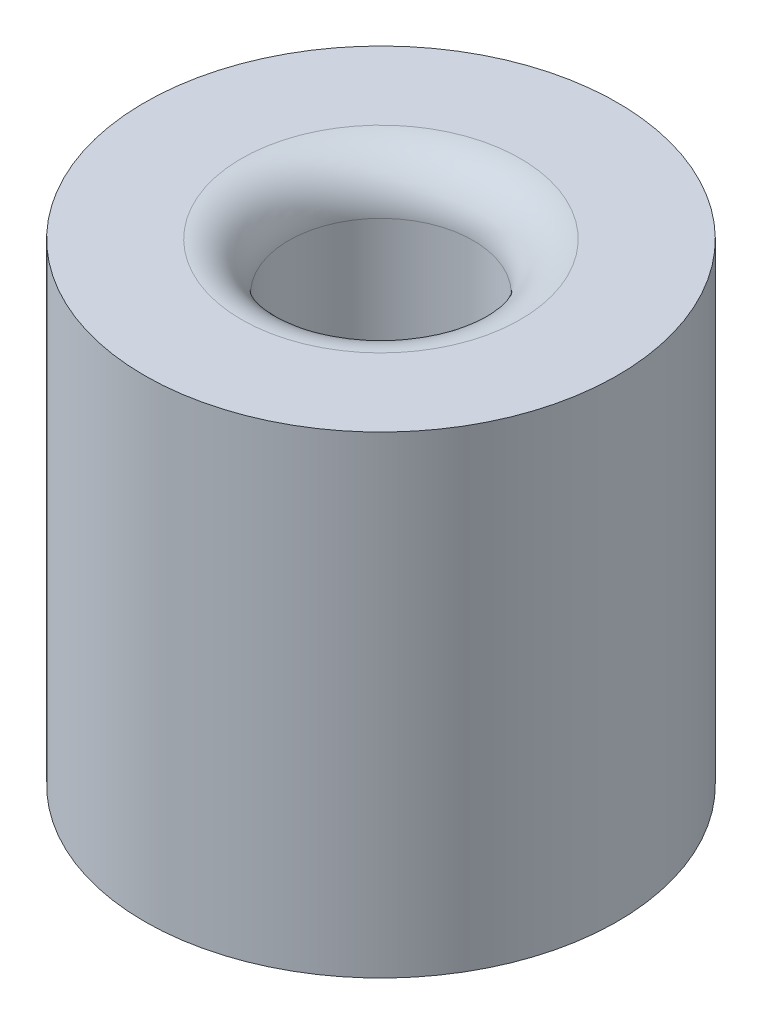
ISO-10303-21;
HEADER;
FILE_DESCRIPTION(('STEP AP214'),'2;1');
FILE_NAME('part.step','',(''),(''),'','','');
FILE_SCHEMA(('AUTOMOTIVE_DESIGN { 1 0 10303 214 1 1 1 1 }'));
ENDSEC;
DATA;
#1=APPLICATION_CONTEXT('core data for automotive mechanical design processes');
#2=APPLICATION_PROTOCOL_DEFINITION('international standard','automotive_design',2000,#1);
#3=PRODUCT_CONTEXT('',#1,'mechanical');
#4=PRODUCT('Part','Part','',(#3));
#5=PRODUCT_RELATED_PRODUCT_CATEGORY('part','',(#4));
#6=PRODUCT_DEFINITION_FORMATION('','',#4);
#7=PRODUCT_DEFINITION_CONTEXT('part definition',#1,'design');
#8=PRODUCT_DEFINITION('design','',#6,#7);
#9=PRODUCT_DEFINITION_SHAPE('','',#8);
#10=(LENGTH_UNIT() NAMED_UNIT(*) SI_UNIT(.MILLI.,.METRE.));
#11=(NAMED_UNIT(*) PLANE_ANGLE_UNIT() SI_UNIT($,.RADIAN.));
#12=(NAMED_UNIT(*) SI_UNIT($,.STERADIAN.) SOLID_ANGLE_UNIT());
#13=UNCERTAINTY_MEASURE_WITH_UNIT(LENGTH_MEASURE(1.E-05),#10,'distance_accuracy_value','');
#14=(GEOMETRIC_REPRESENTATION_CONTEXT(3) GLOBAL_UNCERTAINTY_ASSIGNED_CONTEXT((#13)) GLOBAL_UNIT_ASSIGNED_CONTEXT((#10,
#11,#12)) REPRESENTATION_CONTEXT('',''));
#15=CARTESIAN_POINT('',(0.,0.,0.));
#16=DIRECTION('',(0.,0.,1.));
#17=DIRECTION('',(1.,0.,0.));
#18=AXIS2_PLACEMENT_3D('',#15,#16,#17);
#19=CARTESIAN_POINT('',(0.,10.,0.));
#20=DIRECTION('',(0.,-1.,0.));
#21=DIRECTION('',(0.,0.,-1.));
#22=AXIS2_PLACEMENT_3D('',#19,#20,#21);
#23=CYLINDRICAL_SURFACE('',#22,5.);
#24=CARTESIAN_POINT('',(0.,10.,0.));
#25=DIRECTION('',(0.,1.,0.));
#26=DIRECTION('',(0.,0.,1.));
#27=AXIS2_PLACEMENT_3D('',#24,#25,#26);
#28=CIRCLE('',#27,5.);
#29=CARTESIAN_POINT('',(0.,10.,5.));
#30=VERTEX_POINT('',#29);
#31=EDGE_CURVE('E50',#30,#30,#28,.T.);
#32=ORIENTED_EDGE('',*,*,#31,.F.);
#33=EDGE_LOOP('',(#32));
#34=FACE_BOUND('',#33,.T.);
#35=CARTESIAN_POINT('',(0.,0.,0.));
#36=DIRECTION('',(0.,1.,0.));
#37=DIRECTION('',(0.,0.,1.));
#38=AXIS2_PLACEMENT_3D('',#35,#36,#37);
#39=CIRCLE('',#38,5.);
#40=CARTESIAN_POINT('',(0.,0.,5.));
#41=VERTEX_POINT('',#40);
#42=EDGE_CURVE('E55',#41,#41,#39,.T.);
#43=ORIENTED_EDGE('',*,*,#42,.T.);
#44=EDGE_LOOP('',(#43));
#45=FACE_BOUND('',#44,.T.);
#46=ADVANCED_FACE('F37',(#34,#45),#23,.T.);
#47=CARTESIAN_POINT('',(0.,10.,0.));
#48=DIRECTION('',(0.,1.,0.));
#49=DIRECTION('',(0.,0.,1.));
#50=AXIS2_PLACEMENT_3D('',#47,#48,#49);
#51=PLANE('',#50);
#52=CARTESIAN_POINT('',(0.,10.,0.));
#53=DIRECTION('',(0.,1.,0.));
#54=DIRECTION('',(0.,0.,1.));
#55=AXIS2_PLACEMENT_3D('',#52,#53,#54);
#56=CIRCLE('',#55,2.95);
#57=CARTESIAN_POINT('',(0.,10.,2.95));
#58=VERTEX_POINT('',#57);
#59=EDGE_CURVE('E10',#58,#58,#56,.F.);
#60=ORIENTED_EDGE('',*,*,#59,.T.);
#61=EDGE_LOOP('',(#60));
#62=FACE_BOUND('',#61,.T.);
#63=ORIENTED_EDGE('',*,*,#31,.T.);
#64=EDGE_LOOP('',(#63));
#65=FACE_BOUND('',#64,.T.);
#66=ADVANCED_FACE('F77',(#62,#65),#51,.T.);
#67=CARTESIAN_POINT('',(0.,0.,0.));
#68=DIRECTION('',(0.,1.,0.));
#69=DIRECTION('',(0.,0.,1.));
#70=AXIS2_PLACEMENT_3D('',#67,#68,#69);
#71=PLANE('',#70);
#72=ORIENTED_EDGE('',*,*,#42,.F.);
#73=EDGE_LOOP('',(#72));
#74=FACE_BOUND('',#73,.T.);
#75=ADVANCED_FACE('F70',(#74),#71,.F.);
#76=CARTESIAN_POINT('',(0.,1.4,0.));
#77=DIRECTION('',(0.,1.,0.));
#78=DIRECTION('',(0.,0.,1.));
#79=AXIS2_PLACEMENT_3D('',#76,#77,#78);
#80=CYLINDRICAL_SURFACE('',#79,1.95);
#81=CARTESIAN_POINT('',(0.,9.,0.));
#82=DIRECTION('',(0.,1.,0.));
#83=DIRECTION('',(0.,0.,1.));
#84=AXIS2_PLACEMENT_3D('',#81,#82,#83);
#85=CIRCLE('',#84,1.95);
#86=CARTESIAN_POINT('',(0.,9.,1.95));
#87=VERTEX_POINT('',#86);
#88=EDGE_CURVE('E45',#87,#87,#85,.T.);
#89=CARTESIAN_POINT('',(0.,1.4,0.));
#90=DIRECTION('',(0.,1.,0.));
#91=DIRECTION('',(0.,0.,1.));
#92=AXIS2_PLACEMENT_3D('',#89,#90,#91);
#93=CIRCLE('',#92,1.95);
#94=CARTESIAN_POINT('',(0.,1.4,1.95));
#95=VERTEX_POINT('',#94);
#96=EDGE_CURVE('E60',#95,#95,#93,.T.);
#97=CARTESIAN_POINT('',(0.,9.,1.95));
#98=CARTESIAN_POINT('',(0.,8.92083333333333,1.95));
#99=CARTESIAN_POINT('',(0.,8.84166666666667,1.95));
#100=CARTESIAN_POINT('',(0.,8.68333333333333,1.95));
#101=CARTESIAN_POINT('',(0.,8.60416666666667,1.95));
#102=CARTESIAN_POINT('',(0.,8.44583333333333,1.95));
#103=CARTESIAN_POINT('',(0.,8.36666666666667,1.95));
#104=CARTESIAN_POINT('',(0.,8.20833333333333,1.95));
#105=CARTESIAN_POINT('',(0.,8.12916666666667,1.95));
#106=CARTESIAN_POINT('',(0.,7.97083333333333,1.95));
#107=CARTESIAN_POINT('',(0.,7.89166666666667,1.95));
#108=CARTESIAN_POINT('',(0.,7.73333333333333,1.95));
#109=CARTESIAN_POINT('',(0.,7.65416666666667,1.95));
#110=CARTESIAN_POINT('',(0.,7.49583333333333,1.95));
#111=CARTESIAN_POINT('',(0.,7.41666666666667,1.95));
#112=CARTESIAN_POINT('',(0.,7.25833333333333,1.95));
#113=CARTESIAN_POINT('',(0.,7.17916666666667,1.95));
#114=CARTESIAN_POINT('',(0.,7.02083333333333,1.95));
#115=CARTESIAN_POINT('',(0.,6.94166666666667,1.95));
#116=CARTESIAN_POINT('',(0.,6.78333333333333,1.95));
#117=CARTESIAN_POINT('',(0.,6.70416666666667,1.95));
#118=CARTESIAN_POINT('',(0.,6.54583333333333,1.95));
#119=CARTESIAN_POINT('',(0.,6.46666666666667,1.95));
#120=CARTESIAN_POINT('',(0.,6.30833333333333,1.95));
#121=CARTESIAN_POINT('',(0.,6.22916666666667,1.95));
#122=CARTESIAN_POINT('',(0.,6.07083333333333,1.95));
#123=CARTESIAN_POINT('',(0.,5.99166666666667,1.95));
#124=CARTESIAN_POINT('',(0.,5.83333333333333,1.95));
#125=CARTESIAN_POINT('',(0.,5.75416666666667,1.95));
#126=CARTESIAN_POINT('',(0.,5.59583333333333,1.95));
#127=CARTESIAN_POINT('',(0.,5.51666666666667,1.95));
#128=CARTESIAN_POINT('',(0.,5.35833333333333,1.95));
#129=CARTESIAN_POINT('',(0.,5.27916666666667,1.95));
#130=CARTESIAN_POINT('',(0.,5.12083333333333,1.95));
#131=CARTESIAN_POINT('',(0.,5.04166666666667,1.95));
#132=CARTESIAN_POINT('',(0.,4.88333333333333,1.95));
#133=CARTESIAN_POINT('',(0.,4.80416666666667,1.95));
#134=CARTESIAN_POINT('',(0.,4.64583333333333,1.95));
#135=CARTESIAN_POINT('',(0.,4.56666666666667,1.95));
#136=CARTESIAN_POINT('',(0.,4.40833333333333,1.95));
#137=CARTESIAN_POINT('',(0.,4.32916666666667,1.95));
#138=CARTESIAN_POINT('',(0.,4.17083333333333,1.95));
#139=CARTESIAN_POINT('',(0.,4.09166666666667,1.95));
#140=CARTESIAN_POINT('',(0.,3.93333333333333,1.95));
#141=CARTESIAN_POINT('',(0.,3.85416666666667,1.95));
#142=CARTESIAN_POINT('',(0.,3.69583333333333,1.95));
#143=CARTESIAN_POINT('',(0.,3.61666666666667,1.95));
#144=CARTESIAN_POINT('',(0.,3.45833333333333,1.95));
#145=CARTESIAN_POINT('',(0.,3.37916666666667,1.95));
#146=CARTESIAN_POINT('',(0.,3.22083333333333,1.95));
#147=CARTESIAN_POINT('',(0.,3.14166666666667,1.95));
#148=CARTESIAN_POINT('',(0.,2.98333333333333,1.95));
#149=CARTESIAN_POINT('',(0.,2.90416666666667,1.95));
#150=CARTESIAN_POINT('',(0.,2.74583333333333,1.95));
#151=CARTESIAN_POINT('',(0.,2.66666666666667,1.95));
#152=CARTESIAN_POINT('',(0.,2.50833333333333,1.95));
#153=CARTESIAN_POINT('',(0.,2.42916666666667,1.95));
#154=CARTESIAN_POINT('',(0.,2.27083333333333,1.95));
#155=CARTESIAN_POINT('',(0.,2.19166666666667,1.95));
#156=CARTESIAN_POINT('',(0.,2.03333333333333,1.95));
#157=CARTESIAN_POINT('',(0.,1.95416666666667,1.95));
#158=CARTESIAN_POINT('',(0.,1.79583333333333,1.95));
#159=CARTESIAN_POINT('',(0.,1.71666666666667,1.95));
#160=CARTESIAN_POINT('',(0.,1.55833333333333,1.95));
#161=CARTESIAN_POINT('',(0.,1.47916666666667,1.95));
#162=CARTESIAN_POINT('',(0.,1.4,1.95));
#163=B_SPLINE_CURVE_WITH_KNOTS('',3,(#97,#98,#99,#100,#101,#102,#103,#104,#105,#106,#107,#108,
#109,#110,#111,#112,#113,#114,#115,#116,#117,#118,#119,#120,#121,#122,#123,#124,#125,#126,#127,
#128,#129,#130,#131,#132,#133,#134,#135,#136,#137,#138,#139,#140,#141,#142,#143,#144,#145,#146,
#147,#148,#149,#150,#151,#152,#153,#154,#155,#156,#157,#158,#159,#160,#161,#162),.UNSPECIFIED.,
.F.,.F.,(4,2,2,2,2,2,2,2,2,2,2,2,2,2,2,2,2,2,2,2,2,2,2,2,2,2,2,2,2,2,2,2,4),(0.,
0.237500000000002,0.475,0.712500000000001,0.950000000000001,1.1875,1.425,1.6625,1.9,2.1375,
2.375,2.6125,2.85,3.0875,3.325,3.5625,3.8,4.0375,4.275,4.5125,4.75,4.9875,5.225,5.4625,5.7,
5.9375,6.175,6.4125,6.65,6.8875,7.125,7.3625,7.6),.UNSPECIFIED.);
#164=EDGE_CURVE('BSEAM68',#87,#95,#163,.T.);
#165=ORIENTED_EDGE('',*,*,#88,.T.);
#166=ORIENTED_EDGE('',*,*,#96,.F.);
#167=ORIENTED_EDGE('',*,*,#164,.T.);
#168=ORIENTED_EDGE('',*,*,#164,.F.);
#169=EDGE_LOOP('',(#165,#167,#166,#168));
#170=FACE_BOUND('',#169,.T.);
#171=ADVANCED_FACE('F68',(#170),#80,.F.);
#172=CARTESIAN_POINT('',(0.,1.4,0.));
#173=DIRECTION('',(0.,1.,0.));
#174=DIRECTION('',(0.,0.,1.));
#175=AXIS2_PLACEMENT_3D('',#172,#173,#174);
#176=PLANE('',#175);
#177=ORIENTED_EDGE('',*,*,#96,.T.);
#178=EDGE_LOOP('',(#177));
#179=FACE_BOUND('',#178,.T.);
#180=ADVANCED_FACE('F66',(#179),#176,.T.);
#181=CARTESIAN_POINT('',(0.,9.,0.));
#182=DIRECTION('',(0.,1.,0.));
#183=DIRECTION('',(0.,0.,1.));
#184=AXIS2_PLACEMENT_3D('',#181,#182,#183);
#185=TOROIDAL_SURFACE('',#184,2.95,1.);
#186=ORIENTED_EDGE('',*,*,#59,.F.);
#187=EDGE_LOOP('',(#186));
#188=FACE_BOUND('',#187,.T.);
#189=ORIENTED_EDGE('',*,*,#88,.F.);
#190=EDGE_LOOP('',(#189));
#191=FACE_BOUND('',#190,.T.);
#192=ADVANCED_FACE('F39',(#188,#191),#185,.T.);
#193=CLOSED_SHELL('',(#46,#66,#75,#171,#180,#192));
#194=MANIFOLD_SOLID_BREP('B2',#193);
#195=ADVANCED_BREP_SHAPE_REPRESENTATION('',(#18,#194),#14);
#196=SHAPE_DEFINITION_REPRESENTATION(#9,#195);
ENDSEC;
END-ISO-10303-21;
